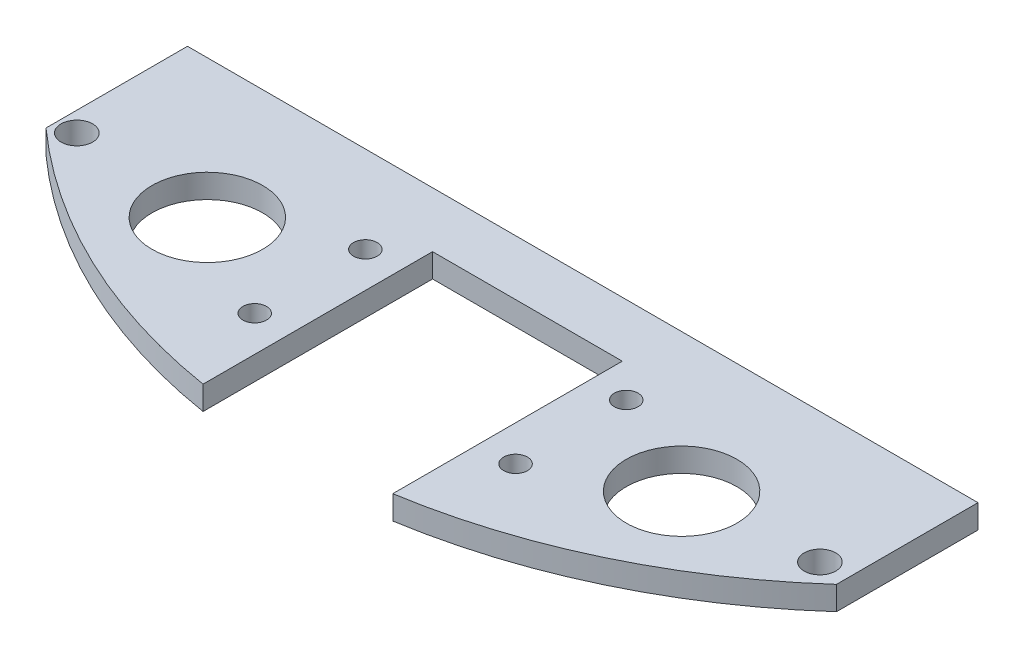
ISO-10303-21;
HEADER;
FILE_DESCRIPTION(('STEP AP214'),'2;1');
FILE_NAME('part.step','',(''),(''),'','','');
FILE_SCHEMA(('AUTOMOTIVE_DESIGN { 1 0 10303 214 1 1 1 1 }'));
ENDSEC;
DATA;
#1=APPLICATION_CONTEXT('core data for automotive mechanical design processes');
#2=APPLICATION_PROTOCOL_DEFINITION('international standard','automotive_design',2000,#1);
#3=PRODUCT_CONTEXT('',#1,'mechanical');
#4=PRODUCT('Part','Part','',(#3));
#5=PRODUCT_RELATED_PRODUCT_CATEGORY('part','',(#4));
#6=PRODUCT_DEFINITION_FORMATION('','',#4);
#7=PRODUCT_DEFINITION_CONTEXT('part definition',#1,'design');
#8=PRODUCT_DEFINITION('design','',#6,#7);
#9=PRODUCT_DEFINITION_SHAPE('','',#8);
#10=(LENGTH_UNIT() NAMED_UNIT(*) SI_UNIT(.MILLI.,.METRE.));
#11=(NAMED_UNIT(*) PLANE_ANGLE_UNIT() SI_UNIT($,.RADIAN.));
#12=(NAMED_UNIT(*) SI_UNIT($,.STERADIAN.) SOLID_ANGLE_UNIT());
#13=UNCERTAINTY_MEASURE_WITH_UNIT(LENGTH_MEASURE(1.E-05),#10,'distance_accuracy_value','');
#14=(GEOMETRIC_REPRESENTATION_CONTEXT(3) GLOBAL_UNCERTAINTY_ASSIGNED_CONTEXT((#13)) GLOBAL_UNIT_ASSIGNED_CONTEXT((#10,
#11,#12)) REPRESENTATION_CONTEXT('',''));
#15=CARTESIAN_POINT('',(0.,0.,0.));
#16=DIRECTION('',(0.,0.,1.));
#17=DIRECTION('',(1.,0.,0.));
#18=AXIS2_PLACEMENT_3D('',#15,#16,#17);
#19=CARTESIAN_POINT('',(0.,3.,0.));
#20=DIRECTION('',(0.,-1.,0.));
#21=DIRECTION('',(0.,0.,-1.));
#22=AXIS2_PLACEMENT_3D('',#19,#20,#21);
#23=CYLINDRICAL_SURFACE('',#22,75.);
#24=DIRECTION('',(0.,1.,0.));
#25=VECTOR('',#24,1.);
#26=CARTESIAN_POINT('',(-12.,0.,74.0337760755184));
#27=LINE('',#26,#25);
#28=CARTESIAN_POINT('',(-12.,0.,74.0337760755184));
#29=VERTEX_POINT('',#28);
#30=CARTESIAN_POINT('',(-12.,3.,74.0337760755184));
#31=VERTEX_POINT('',#30);
#32=EDGE_CURVE('E99',#29,#31,#27,.T.);
#33=ORIENTED_EDGE('',*,*,#32,.T.);
#34=CARTESIAN_POINT('',(0.,3.,0.));
#35=DIRECTION('',(0.,1.,0.));
#36=DIRECTION('',(0.,0.,1.));
#37=AXIS2_PLACEMENT_3D('',#34,#35,#36);
#38=CIRCLE('',#37,75.);
#39=CARTESIAN_POINT('',(-50.,3.,55.9016994374947));
#40=VERTEX_POINT('',#39);
#41=EDGE_CURVE('E11',#40,#31,#38,.T.);
#42=ORIENTED_EDGE('',*,*,#41,.F.);
#43=DIRECTION('',(0.,1.,0.));
#44=VECTOR('',#43,1.);
#45=CARTESIAN_POINT('',(-50.,0.,55.9016994374947));
#46=LINE('',#45,#44);
#47=CARTESIAN_POINT('',(-50.,0.,55.9016994374947));
#48=VERTEX_POINT('',#47);
#49=EDGE_CURVE('E119',#48,#40,#46,.T.);
#50=ORIENTED_EDGE('',*,*,#49,.F.);
#51=CARTESIAN_POINT('',(0.,0.,0.));
#52=DIRECTION('',(0.,1.,0.));
#53=DIRECTION('',(0.,0.,1.));
#54=AXIS2_PLACEMENT_3D('',#51,#52,#53);
#55=CIRCLE('',#54,75.);
#56=EDGE_CURVE('E36',#48,#29,#55,.T.);
#57=ORIENTED_EDGE('',*,*,#56,.T.);
#58=EDGE_LOOP('',(#33,#42,#50,#57));
#59=FACE_BOUND('',#58,.T.);
#60=ADVANCED_FACE('F32',(#59),#23,.T.);
#61=CARTESIAN_POINT('',(0.,3.,0.));
#62=DIRECTION('',(0.,1.,0.));
#63=DIRECTION('',(0.,0.,1.));
#64=AXIS2_PLACEMENT_3D('',#61,#62,#63);
#65=PLANE('',#64);
#66=DIRECTION('',(0.,0.,-1.));
#67=VECTOR('',#66,1.);
#68=CARTESIAN_POINT('',(50.,3.,0.));
#69=LINE('',#68,#67);
#70=CARTESIAN_POINT('',(50.,3.,55.9016994374947));
#71=VERTEX_POINT('',#70);
#72=CARTESIAN_POINT('',(50.,3.,38.));
#73=VERTEX_POINT('',#72);
#74=EDGE_CURVE('E137',#71,#73,#69,.T.);
#75=ORIENTED_EDGE('',*,*,#74,.T.);
#76=DIRECTION('',(1.,0.,0.));
#77=VECTOR('',#76,1.);
#78=CARTESIAN_POINT('',(-20.5,3.,38.));
#79=LINE('',#78,#77);
#80=CARTESIAN_POINT('',(-50.,3.,38.));
#81=VERTEX_POINT('',#80);
#82=EDGE_CURVE('E56',#81,#73,#79,.T.);
#83=ORIENTED_EDGE('',*,*,#82,.F.);
#84=DIRECTION('',(0.,0.,-1.));
#85=VECTOR('',#84,1.);
#86=CARTESIAN_POINT('',(-50.,3.,0.));
#87=LINE('',#86,#85);
#88=EDGE_CURVE('E134',#40,#81,#87,.T.);
#89=ORIENTED_EDGE('',*,*,#88,.F.);
#90=ORIENTED_EDGE('',*,*,#41,.T.);
#91=DIRECTION('',(0.,0.,-1.));
#92=VECTOR('',#91,1.);
#93=CARTESIAN_POINT('',(-12.,3.,0.));
#94=LINE('',#93,#92);
#95=CARTESIAN_POINT('',(-12.,3.,45.));
#96=VERTEX_POINT('',#95);
#97=EDGE_CURVE('E104',#31,#96,#94,.T.);
#98=ORIENTED_EDGE('',*,*,#97,.T.);
#99=DIRECTION('',(-1.,0.,0.));
#100=VECTOR('',#99,1.);
#101=CARTESIAN_POINT('',(0.,3.,45.));
#102=LINE('',#101,#100);
#103=CARTESIAN_POINT('',(12.,3.,45.));
#104=VERTEX_POINT('',#103);
#105=EDGE_CURVE('E116',#104,#96,#102,.T.);
#106=ORIENTED_EDGE('',*,*,#105,.F.);
#107=DIRECTION('',(0.,0.,-1.));
#108=VECTOR('',#107,1.);
#109=CARTESIAN_POINT('',(12.,3.,0.));
#110=LINE('',#109,#108);
#111=CARTESIAN_POINT('',(12.,3.,74.0337760755184));
#112=VERTEX_POINT('',#111);
#113=EDGE_CURVE('E157',#112,#104,#110,.T.);
#114=ORIENTED_EDGE('',*,*,#113,.F.);
#115=EDGE_CURVE('E41',#112,#71,#38,.T.);
#116=ORIENTED_EDGE('',*,*,#115,.T.);
#117=EDGE_LOOP('',(#75,#83,#89,#90,#98,#106,#114,#116));
#118=FACE_BOUND('',#117,.T.);
#119=CARTESIAN_POINT('',(16.5,3.,49.));
#120=DIRECTION('',(0.,1.,0.));
#121=DIRECTION('',(0.,0.,-1.));
#122=AXIS2_PLACEMENT_3D('',#119,#120,#121);
#123=CIRCLE('',#122,1.5);
#124=CARTESIAN_POINT('',(16.5,3.,47.5));
#125=VERTEX_POINT('',#124);
#126=EDGE_CURVE('E206',#125,#125,#123,.T.);
#127=ORIENTED_EDGE('',*,*,#126,.F.);
#128=EDGE_LOOP('',(#127));
#129=FACE_BOUND('',#128,.T.);
#130=CARTESIAN_POINT('',(16.5,3.,63.));
#131=DIRECTION('',(0.,1.,0.));
#132=DIRECTION('',(0.,0.,-1.));
#133=AXIS2_PLACEMENT_3D('',#130,#131,#132);
#134=CIRCLE('',#133,1.5);
#135=CARTESIAN_POINT('',(16.5,3.,61.5));
#136=VERTEX_POINT('',#135);
#137=EDGE_CURVE('E200',#136,#136,#134,.T.);
#138=ORIENTED_EDGE('',*,*,#137,.F.);
#139=EDGE_LOOP('',(#138));
#140=FACE_BOUND('',#139,.T.);
#141=CARTESIAN_POINT('',(-16.5,3.,63.));
#142=DIRECTION('',(0.,1.,0.));
#143=DIRECTION('',(0.,0.,1.));
#144=AXIS2_PLACEMENT_3D('',#141,#142,#143);
#145=CIRCLE('',#144,1.5);
#146=CARTESIAN_POINT('',(-16.5,3.,64.5));
#147=VERTEX_POINT('',#146);
#148=EDGE_CURVE('E194',#147,#147,#145,.T.);
#149=ORIENTED_EDGE('',*,*,#148,.F.);
#150=EDGE_LOOP('',(#149));
#151=FACE_BOUND('',#150,.T.);
#152=CARTESIAN_POINT('',(-16.5,3.,49.));
#153=DIRECTION('',(0.,1.,0.));
#154=DIRECTION('',(0.,0.,1.));
#155=AXIS2_PLACEMENT_3D('',#152,#153,#154);
#156=CIRCLE('',#155,1.5);
#157=CARTESIAN_POINT('',(-16.5,3.,50.5));
#158=VERTEX_POINT('',#157);
#159=EDGE_CURVE('E188',#158,#158,#156,.T.);
#160=ORIENTED_EDGE('',*,*,#159,.F.);
#161=EDGE_LOOP('',(#160));
#162=FACE_BOUND('',#161,.T.);
#163=CARTESIAN_POINT('',(46.5,3.,54.5));
#164=DIRECTION('',(0.,1.,0.));
#165=DIRECTION('',(0.,0.,1.));
#166=AXIS2_PLACEMENT_3D('',#163,#164,#165);
#167=CIRCLE('',#166,2.);
#168=CARTESIAN_POINT('',(46.5,3.,56.5));
#169=VERTEX_POINT('',#168);
#170=EDGE_CURVE('E182',#169,#169,#167,.T.);
#171=ORIENTED_EDGE('',*,*,#170,.F.);
#172=EDGE_LOOP('',(#171));
#173=FACE_BOUND('',#172,.T.);
#174=CARTESIAN_POINT('',(-47.5,3.,54.5));
#175=DIRECTION('',(0.,1.,0.));
#176=DIRECTION('',(0.,0.,1.));
#177=AXIS2_PLACEMENT_3D('',#174,#175,#176);
#178=CIRCLE('',#177,2.);
#179=CARTESIAN_POINT('',(-47.5,3.,56.5));
#180=VERTEX_POINT('',#179);
#181=EDGE_CURVE('E176',#180,#180,#178,.T.);
#182=ORIENTED_EDGE('',*,*,#181,.F.);
#183=EDGE_LOOP('',(#182));
#184=FACE_BOUND('',#183,.T.);
#185=CARTESIAN_POINT('',(30.,3.,55.4937760755184));
#186=DIRECTION('',(0.,1.,0.));
#187=DIRECTION('',(0.,0.,-1.));
#188=AXIS2_PLACEMENT_3D('',#185,#186,#187);
#189=CIRCLE('',#188,7.);
#190=CARTESIAN_POINT('',(30.,3.,48.4937760755184));
#191=VERTEX_POINT('',#190);
#192=EDGE_CURVE('E170',#191,#191,#189,.T.);
#193=ORIENTED_EDGE('',*,*,#192,.F.);
#194=EDGE_LOOP('',(#193));
#195=FACE_BOUND('',#194,.T.);
#196=CARTESIAN_POINT('',(-30.,3.,55.4937760755184));
#197=DIRECTION('',(0.,1.,0.));
#198=DIRECTION('',(0.,0.,1.));
#199=AXIS2_PLACEMENT_3D('',#196,#197,#198);
#200=CIRCLE('',#199,7.);
#201=CARTESIAN_POINT('',(-30.,3.,62.4937760755184));
#202=VERTEX_POINT('',#201);
#203=EDGE_CURVE('E164',#202,#202,#200,.T.);
#204=ORIENTED_EDGE('',*,*,#203,.F.);
#205=EDGE_LOOP('',(#204));
#206=FACE_BOUND('',#205,.T.);
#207=ADVANCED_FACE('F221',(#118,#129,#140,#151,#162,#173,#184,#195,#206),#65,.T.);
#208=CARTESIAN_POINT('',(0.,0.,0.));
#209=DIRECTION('',(0.,1.,0.));
#210=DIRECTION('',(0.,0.,1.));
#211=AXIS2_PLACEMENT_3D('',#208,#209,#210);
#212=PLANE('',#211);
#213=CARTESIAN_POINT('',(16.5,0.,49.));
#214=DIRECTION('',(0.,1.,0.));
#215=DIRECTION('',(0.,0.,-1.));
#216=AXIS2_PLACEMENT_3D('',#213,#214,#215);
#217=CIRCLE('',#216,1.5);
#218=CARTESIAN_POINT('',(16.5,0.,47.5));
#219=VERTEX_POINT('',#218);
#220=EDGE_CURVE('E203',#219,#219,#217,.T.);
#221=ORIENTED_EDGE('',*,*,#220,.T.);
#222=EDGE_LOOP('',(#221));
#223=FACE_BOUND('',#222,.T.);
#224=CARTESIAN_POINT('',(16.5,0.,63.));
#225=DIRECTION('',(0.,1.,0.));
#226=DIRECTION('',(0.,0.,-1.));
#227=AXIS2_PLACEMENT_3D('',#224,#225,#226);
#228=CIRCLE('',#227,1.5);
#229=CARTESIAN_POINT('',(16.5,0.,61.5));
#230=VERTEX_POINT('',#229);
#231=EDGE_CURVE('E197',#230,#230,#228,.T.);
#232=ORIENTED_EDGE('',*,*,#231,.T.);
#233=EDGE_LOOP('',(#232));
#234=FACE_BOUND('',#233,.T.);
#235=CARTESIAN_POINT('',(-16.5,0.,63.));
#236=DIRECTION('',(0.,1.,0.));
#237=DIRECTION('',(0.,0.,1.));
#238=AXIS2_PLACEMENT_3D('',#235,#236,#237);
#239=CIRCLE('',#238,1.5);
#240=CARTESIAN_POINT('',(-16.5,0.,64.5));
#241=VERTEX_POINT('',#240);
#242=EDGE_CURVE('E191',#241,#241,#239,.T.);
#243=ORIENTED_EDGE('',*,*,#242,.T.);
#244=EDGE_LOOP('',(#243));
#245=FACE_BOUND('',#244,.T.);
#246=CARTESIAN_POINT('',(-16.5,0.,49.));
#247=DIRECTION('',(0.,1.,0.));
#248=DIRECTION('',(0.,0.,1.));
#249=AXIS2_PLACEMENT_3D('',#246,#247,#248);
#250=CIRCLE('',#249,1.5);
#251=CARTESIAN_POINT('',(-16.5,0.,50.5));
#252=VERTEX_POINT('',#251);
#253=EDGE_CURVE('E185',#252,#252,#250,.T.);
#254=ORIENTED_EDGE('',*,*,#253,.T.);
#255=EDGE_LOOP('',(#254));
#256=FACE_BOUND('',#255,.T.);
#257=CARTESIAN_POINT('',(46.5,0.,54.5));
#258=DIRECTION('',(0.,1.,0.));
#259=DIRECTION('',(0.,0.,1.));
#260=AXIS2_PLACEMENT_3D('',#257,#258,#259);
#261=CIRCLE('',#260,2.);
#262=CARTESIAN_POINT('',(46.5,0.,56.5));
#263=VERTEX_POINT('',#262);
#264=EDGE_CURVE('E179',#263,#263,#261,.T.);
#265=ORIENTED_EDGE('',*,*,#264,.T.);
#266=EDGE_LOOP('',(#265));
#267=FACE_BOUND('',#266,.T.);
#268=CARTESIAN_POINT('',(-47.5,0.,54.5));
#269=DIRECTION('',(0.,1.,0.));
#270=DIRECTION('',(0.,0.,1.));
#271=AXIS2_PLACEMENT_3D('',#268,#269,#270);
#272=CIRCLE('',#271,2.);
#273=CARTESIAN_POINT('',(-47.5,0.,56.5));
#274=VERTEX_POINT('',#273);
#275=EDGE_CURVE('E173',#274,#274,#272,.T.);
#276=ORIENTED_EDGE('',*,*,#275,.T.);
#277=EDGE_LOOP('',(#276));
#278=FACE_BOUND('',#277,.T.);
#279=CARTESIAN_POINT('',(30.,0.,55.4937760755184));
#280=DIRECTION('',(0.,1.,0.));
#281=DIRECTION('',(0.,0.,-1.));
#282=AXIS2_PLACEMENT_3D('',#279,#280,#281);
#283=CIRCLE('',#282,7.);
#284=CARTESIAN_POINT('',(30.,0.,48.4937760755184));
#285=VERTEX_POINT('',#284);
#286=EDGE_CURVE('E167',#285,#285,#283,.T.);
#287=ORIENTED_EDGE('',*,*,#286,.T.);
#288=EDGE_LOOP('',(#287));
#289=FACE_BOUND('',#288,.T.);
#290=CARTESIAN_POINT('',(-30.,0.,55.4937760755184));
#291=DIRECTION('',(0.,1.,0.));
#292=DIRECTION('',(0.,0.,1.));
#293=AXIS2_PLACEMENT_3D('',#290,#291,#292);
#294=CIRCLE('',#293,7.);
#295=CARTESIAN_POINT('',(-30.,0.,62.4937760755184));
#296=VERTEX_POINT('',#295);
#297=EDGE_CURVE('E161',#296,#296,#294,.T.);
#298=ORIENTED_EDGE('',*,*,#297,.T.);
#299=EDGE_LOOP('',(#298));
#300=FACE_BOUND('',#299,.T.);
#301=DIRECTION('',(1.,0.,0.));
#302=VECTOR('',#301,1.);
#303=CARTESIAN_POINT('',(-20.5,0.,38.));
#304=LINE('',#303,#302);
#305=CARTESIAN_POINT('',(-50.,0.,38.));
#306=VERTEX_POINT('',#305);
#307=CARTESIAN_POINT('',(50.,0.,38.));
#308=VERTEX_POINT('',#307);
#309=EDGE_CURVE('E145',#306,#308,#304,.T.);
#310=ORIENTED_EDGE('',*,*,#309,.T.);
#311=DIRECTION('',(0.,0.,-1.));
#312=VECTOR('',#311,1.);
#313=CARTESIAN_POINT('',(50.,0.,0.));
#314=LINE('',#313,#312);
#315=CARTESIAN_POINT('',(50.,0.,55.9016994374947));
#316=VERTEX_POINT('',#315);
#317=EDGE_CURVE('E136',#316,#308,#314,.T.);
#318=ORIENTED_EDGE('',*,*,#317,.F.);
#319=CARTESIAN_POINT('',(12.,0.,74.0337760755184));
#320=VERTEX_POINT('',#319);
#321=EDGE_CURVE('E120',#320,#316,#55,.T.);
#322=ORIENTED_EDGE('',*,*,#321,.F.);
#323=DIRECTION('',(0.,0.,-1.));
#324=VECTOR('',#323,1.);
#325=CARTESIAN_POINT('',(12.,0.,0.));
#326=LINE('',#325,#324);
#327=CARTESIAN_POINT('',(12.,0.,45.));
#328=VERTEX_POINT('',#327);
#329=EDGE_CURVE('E115',#320,#328,#326,.T.);
#330=ORIENTED_EDGE('',*,*,#329,.T.);
#331=DIRECTION('',(-1.,0.,0.));
#332=VECTOR('',#331,1.);
#333=CARTESIAN_POINT('',(0.,0.,45.));
#334=LINE('',#333,#332);
#335=CARTESIAN_POINT('',(-12.,0.,45.));
#336=VERTEX_POINT('',#335);
#337=EDGE_CURVE('E48',#328,#336,#334,.T.);
#338=ORIENTED_EDGE('',*,*,#337,.T.);
#339=DIRECTION('',(0.,0.,-1.));
#340=VECTOR('',#339,1.);
#341=CARTESIAN_POINT('',(-12.,0.,0.));
#342=LINE('',#341,#340);
#343=EDGE_CURVE('E102',#29,#336,#342,.T.);
#344=ORIENTED_EDGE('',*,*,#343,.F.);
#345=ORIENTED_EDGE('',*,*,#56,.F.);
#346=DIRECTION('',(0.,0.,-1.));
#347=VECTOR('',#346,1.);
#348=CARTESIAN_POINT('',(-50.,0.,0.));
#349=LINE('',#348,#347);
#350=EDGE_CURVE('E131',#48,#306,#349,.T.);
#351=ORIENTED_EDGE('',*,*,#350,.T.);
#352=EDGE_LOOP('',(#310,#318,#322,#330,#338,#344,#345,#351));
#353=FACE_BOUND('',#352,.T.);
#354=ADVANCED_FACE('F112',(#223,#234,#245,#256,#267,#278,#289,#300,#353),#212,.F.);
#355=CARTESIAN_POINT('',(-50.,0.,0.));
#356=DIRECTION('',(1.,0.,0.));
#357=DIRECTION('',(0.,0.,-1.));
#358=AXIS2_PLACEMENT_3D('',#355,#356,#357);
#359=PLANE('',#358);
#360=ORIENTED_EDGE('',*,*,#88,.T.);
#361=DIRECTION('',(0.,1.,0.));
#362=VECTOR('',#361,1.);
#363=CARTESIAN_POINT('',(-50.,0.,38.));
#364=LINE('',#363,#362);
#365=EDGE_CURVE('E140',#306,#81,#364,.T.);
#366=ORIENTED_EDGE('',*,*,#365,.F.);
#367=ORIENTED_EDGE('',*,*,#350,.F.);
#368=ORIENTED_EDGE('',*,*,#49,.T.);
#369=EDGE_LOOP('',(#360,#366,#367,#368));
#370=FACE_BOUND('',#369,.T.);
#371=ADVANCED_FACE('F263',(#370),#359,.F.);
#372=ORIENTED_EDGE('',*,*,#115,.F.);
#373=DIRECTION('',(0.,1.,0.));
#374=VECTOR('',#373,1.);
#375=CARTESIAN_POINT('',(12.,0.,74.0337760755184));
#376=LINE('',#375,#374);
#377=EDGE_CURVE('E108',#320,#112,#376,.T.);
#378=ORIENTED_EDGE('',*,*,#377,.F.);
#379=ORIENTED_EDGE('',*,*,#321,.T.);
#380=DIRECTION('',(0.,1.,0.));
#381=VECTOR('',#380,1.);
#382=CARTESIAN_POINT('',(50.,0.,55.9016994374947));
#383=LINE('',#382,#381);
#384=EDGE_CURVE('E126',#316,#71,#383,.T.);
#385=ORIENTED_EDGE('',*,*,#384,.T.);
#386=EDGE_LOOP('',(#372,#378,#379,#385));
#387=FACE_BOUND('',#386,.T.);
#388=ADVANCED_FACE('F34',(#387),#23,.T.);
#389=CARTESIAN_POINT('',(50.,0.,0.));
#390=DIRECTION('',(1.,0.,0.));
#391=DIRECTION('',(0.,0.,-1.));
#392=AXIS2_PLACEMENT_3D('',#389,#390,#391);
#393=PLANE('',#392);
#394=DIRECTION('',(0.,1.,0.));
#395=VECTOR('',#394,1.);
#396=CARTESIAN_POINT('',(50.,0.,38.));
#397=LINE('',#396,#395);
#398=EDGE_CURVE('E147',#308,#73,#397,.T.);
#399=ORIENTED_EDGE('',*,*,#398,.T.);
#400=ORIENTED_EDGE('',*,*,#74,.F.);
#401=ORIENTED_EDGE('',*,*,#384,.F.);
#402=ORIENTED_EDGE('',*,*,#317,.T.);
#403=EDGE_LOOP('',(#399,#400,#401,#402));
#404=FACE_BOUND('',#403,.T.);
#405=ADVANCED_FACE('F262',(#404),#393,.T.);
#406=CARTESIAN_POINT('',(-20.5,0.,38.));
#407=DIRECTION('',(0.,0.,1.));
#408=DIRECTION('',(1.,0.,0.));
#409=AXIS2_PLACEMENT_3D('',#406,#407,#408);
#410=PLANE('',#409);
#411=ORIENTED_EDGE('',*,*,#82,.T.);
#412=ORIENTED_EDGE('',*,*,#398,.F.);
#413=ORIENTED_EDGE('',*,*,#309,.F.);
#414=ORIENTED_EDGE('',*,*,#365,.T.);
#415=EDGE_LOOP('',(#411,#412,#413,#414));
#416=FACE_BOUND('',#415,.T.);
#417=ADVANCED_FACE('F268',(#416),#410,.F.);
#418=CARTESIAN_POINT('',(-12.,0.,0.));
#419=DIRECTION('',(1.,0.,0.));
#420=DIRECTION('',(0.,0.,-1.));
#421=AXIS2_PLACEMENT_3D('',#418,#419,#420);
#422=PLANE('',#421);
#423=ORIENTED_EDGE('',*,*,#97,.F.);
#424=ORIENTED_EDGE('',*,*,#32,.F.);
#425=ORIENTED_EDGE('',*,*,#343,.T.);
#426=DIRECTION('',(0.,1.,0.));
#427=VECTOR('',#426,1.);
#428=CARTESIAN_POINT('',(-12.,0.,45.));
#429=LINE('',#428,#427);
#430=EDGE_CURVE('E149',#336,#96,#429,.T.);
#431=ORIENTED_EDGE('',*,*,#430,.T.);
#432=EDGE_LOOP('',(#423,#424,#425,#431));
#433=FACE_BOUND('',#432,.T.);
#434=ADVANCED_FACE('F101',(#433),#422,.T.);
#435=CARTESIAN_POINT('',(0.,0.,45.));
#436=DIRECTION('',(0.,0.,-1.));
#437=DIRECTION('',(-1.,0.,0.));
#438=AXIS2_PLACEMENT_3D('',#435,#436,#437);
#439=PLANE('',#438);
#440=ORIENTED_EDGE('',*,*,#105,.T.);
#441=ORIENTED_EDGE('',*,*,#430,.F.);
#442=ORIENTED_EDGE('',*,*,#337,.F.);
#443=DIRECTION('',(0.,1.,0.));
#444=VECTOR('',#443,1.);
#445=CARTESIAN_POINT('',(12.,0.,45.));
#446=LINE('',#445,#444);
#447=EDGE_CURVE('E152',#328,#104,#446,.T.);
#448=ORIENTED_EDGE('',*,*,#447,.T.);
#449=EDGE_LOOP('',(#440,#441,#442,#448));
#450=FACE_BOUND('',#449,.T.);
#451=ADVANCED_FACE('F253',(#450),#439,.F.);
#452=CARTESIAN_POINT('',(12.,0.,0.));
#453=DIRECTION('',(1.,0.,0.));
#454=DIRECTION('',(0.,0.,-1.));
#455=AXIS2_PLACEMENT_3D('',#452,#453,#454);
#456=PLANE('',#455);
#457=ORIENTED_EDGE('',*,*,#113,.T.);
#458=ORIENTED_EDGE('',*,*,#447,.F.);
#459=ORIENTED_EDGE('',*,*,#329,.F.);
#460=ORIENTED_EDGE('',*,*,#377,.T.);
#461=EDGE_LOOP('',(#457,#458,#459,#460));
#462=FACE_BOUND('',#461,.T.);
#463=ADVANCED_FACE('F243',(#462),#456,.F.);
#464=CARTESIAN_POINT('',(-30.,0.,55.4937760755184));
#465=DIRECTION('',(0.,1.,0.));
#466=DIRECTION('',(0.,0.,1.));
#467=AXIS2_PLACEMENT_3D('',#464,#465,#466);
#468=CYLINDRICAL_SURFACE('',#467,7.);
#469=ORIENTED_EDGE('',*,*,#297,.F.);
#470=EDGE_LOOP('',(#469));
#471=FACE_BOUND('',#470,.T.);
#472=ORIENTED_EDGE('',*,*,#203,.T.);
#473=EDGE_LOOP('',(#472));
#474=FACE_BOUND('',#473,.T.);
#475=ADVANCED_FACE('F240',(#471,#474),#468,.F.);
#476=CARTESIAN_POINT('',(30.,0.,55.4937760755184));
#477=DIRECTION('',(0.,1.,0.));
#478=DIRECTION('',(0.,0.,1.));
#479=AXIS2_PLACEMENT_3D('',#476,#477,#478);
#480=CYLINDRICAL_SURFACE('',#479,7.);
#481=ORIENTED_EDGE('',*,*,#286,.F.);
#482=EDGE_LOOP('',(#481));
#483=FACE_BOUND('',#482,.T.);
#484=ORIENTED_EDGE('',*,*,#192,.T.);
#485=EDGE_LOOP('',(#484));
#486=FACE_BOUND('',#485,.T.);
#487=ADVANCED_FACE('F242',(#483,#486),#480,.F.);
#488=CARTESIAN_POINT('',(-47.5,0.,54.5));
#489=DIRECTION('',(0.,1.,0.));
#490=DIRECTION('',(0.,0.,1.));
#491=AXIS2_PLACEMENT_3D('',#488,#489,#490);
#492=CYLINDRICAL_SURFACE('',#491,2.);
#493=ORIENTED_EDGE('',*,*,#275,.F.);
#494=EDGE_LOOP('',(#493));
#495=FACE_BOUND('',#494,.T.);
#496=ORIENTED_EDGE('',*,*,#181,.T.);
#497=EDGE_LOOP('',(#496));
#498=FACE_BOUND('',#497,.T.);
#499=ADVANCED_FACE('F250',(#495,#498),#492,.F.);
#500=CARTESIAN_POINT('',(46.5,0.,54.5));
#501=DIRECTION('',(0.,1.,0.));
#502=DIRECTION('',(0.,0.,1.));
#503=AXIS2_PLACEMENT_3D('',#500,#501,#502);
#504=CYLINDRICAL_SURFACE('',#503,2.);
#505=ORIENTED_EDGE('',*,*,#264,.F.);
#506=EDGE_LOOP('',(#505));
#507=FACE_BOUND('',#506,.T.);
#508=ORIENTED_EDGE('',*,*,#170,.T.);
#509=EDGE_LOOP('',(#508));
#510=FACE_BOUND('',#509,.T.);
#511=ADVANCED_FACE('F349',(#507,#510),#504,.F.);
#512=CARTESIAN_POINT('',(-16.5,0.,49.));
#513=DIRECTION('',(0.,1.,0.));
#514=DIRECTION('',(0.,0.,1.));
#515=AXIS2_PLACEMENT_3D('',#512,#513,#514);
#516=CYLINDRICAL_SURFACE('',#515,1.5);
#517=ORIENTED_EDGE('',*,*,#253,.F.);
#518=EDGE_LOOP('',(#517));
#519=FACE_BOUND('',#518,.T.);
#520=ORIENTED_EDGE('',*,*,#159,.T.);
#521=EDGE_LOOP('',(#520));
#522=FACE_BOUND('',#521,.T.);
#523=ADVANCED_FACE('F359',(#519,#522),#516,.F.);
#524=CARTESIAN_POINT('',(-16.5,0.,63.));
#525=DIRECTION('',(0.,1.,0.));
#526=DIRECTION('',(0.,0.,1.));
#527=AXIS2_PLACEMENT_3D('',#524,#525,#526);
#528=CYLINDRICAL_SURFACE('',#527,1.5);
#529=ORIENTED_EDGE('',*,*,#242,.F.);
#530=EDGE_LOOP('',(#529));
#531=FACE_BOUND('',#530,.T.);
#532=ORIENTED_EDGE('',*,*,#148,.T.);
#533=EDGE_LOOP('',(#532));
#534=FACE_BOUND('',#533,.T.);
#535=ADVANCED_FACE('F370',(#531,#534),#528,.F.);
#536=CARTESIAN_POINT('',(16.5,0.,63.));
#537=DIRECTION('',(0.,1.,0.));
#538=DIRECTION('',(0.,0.,1.));
#539=AXIS2_PLACEMENT_3D('',#536,#537,#538);
#540=CYLINDRICAL_SURFACE('',#539,1.5);
#541=ORIENTED_EDGE('',*,*,#231,.F.);
#542=EDGE_LOOP('',(#541));
#543=FACE_BOUND('',#542,.T.);
#544=ORIENTED_EDGE('',*,*,#137,.T.);
#545=EDGE_LOOP('',(#544));
#546=FACE_BOUND('',#545,.T.);
#547=ADVANCED_FACE('F217',(#543,#546),#540,.F.);
#548=CARTESIAN_POINT('',(16.5,0.,49.));
#549=DIRECTION('',(0.,1.,0.));
#550=DIRECTION('',(0.,0.,1.));
#551=AXIS2_PLACEMENT_3D('',#548,#549,#550);
#552=CYLINDRICAL_SURFACE('',#551,1.5);
#553=ORIENTED_EDGE('',*,*,#220,.F.);
#554=EDGE_LOOP('',(#553));
#555=FACE_BOUND('',#554,.T.);
#556=ORIENTED_EDGE('',*,*,#126,.T.);
#557=EDGE_LOOP('',(#556));
#558=FACE_BOUND('',#557,.T.);
#559=ADVANCED_FACE('F214',(#555,#558),#552,.F.);
#560=CLOSED_SHELL('',(#60,#207,#354,#371,#388,#405,#417,#434,#451,#463,#475,#487,#499,#511,#523,
#535,#547,#559));
#561=MANIFOLD_SOLID_BREP('B2',#560);
#562=ADVANCED_BREP_SHAPE_REPRESENTATION('',(#18,#561),#14);
#563=SHAPE_DEFINITION_REPRESENTATION(#9,#562);
ENDSEC;
END-ISO-10303-21;
